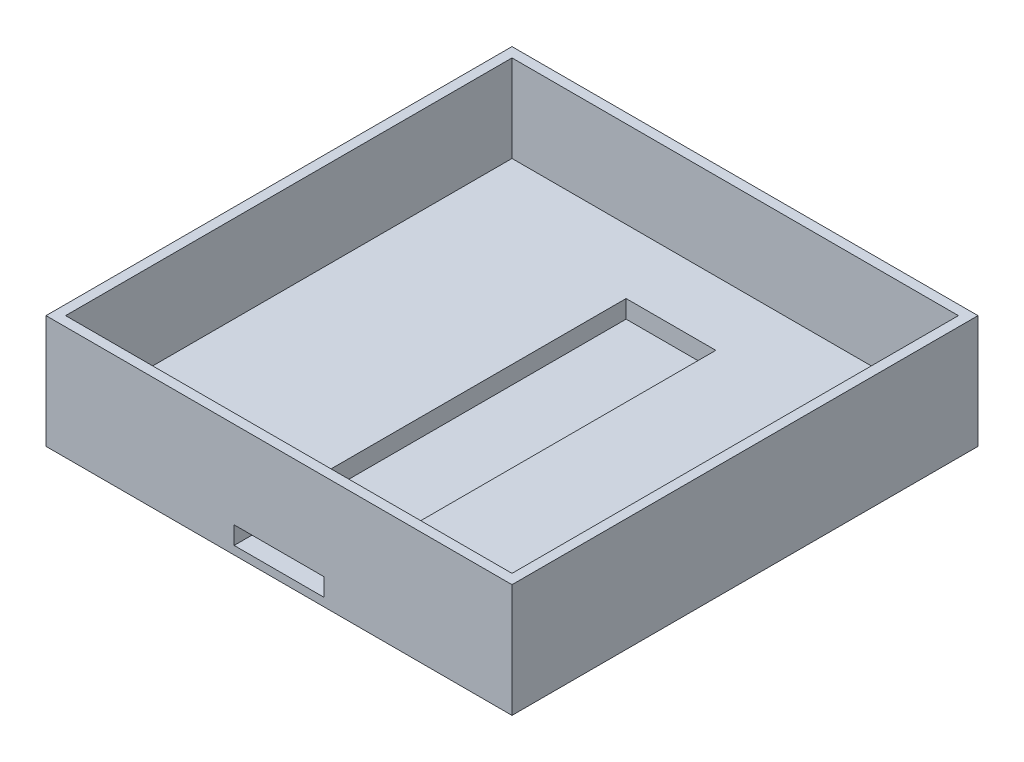
ISO-10303-21;
HEADER;
FILE_DESCRIPTION(('STEP AP214'),'2;1');
FILE_NAME('part.step','',(''),(''),'','','');
FILE_SCHEMA(('AUTOMOTIVE_DESIGN { 1 0 10303 214 1 1 1 1 }'));
ENDSEC;
DATA;
#1=APPLICATION_CONTEXT('core data for automotive mechanical design processes');
#2=APPLICATION_PROTOCOL_DEFINITION('international standard','automotive_design',2000,#1);
#3=PRODUCT_CONTEXT('',#1,'mechanical');
#4=PRODUCT('Part','Part','',(#3));
#5=PRODUCT_RELATED_PRODUCT_CATEGORY('part','',(#4));
#6=PRODUCT_DEFINITION_FORMATION('','',#4);
#7=PRODUCT_DEFINITION_CONTEXT('part definition',#1,'design');
#8=PRODUCT_DEFINITION('design','',#6,#7);
#9=PRODUCT_DEFINITION_SHAPE('','',#8);
#10=(LENGTH_UNIT() NAMED_UNIT(*) SI_UNIT(.MILLI.,.METRE.));
#11=(NAMED_UNIT(*) PLANE_ANGLE_UNIT() SI_UNIT($,.RADIAN.));
#12=(NAMED_UNIT(*) SI_UNIT($,.STERADIAN.) SOLID_ANGLE_UNIT());
#13=UNCERTAINTY_MEASURE_WITH_UNIT(LENGTH_MEASURE(1.E-05),#10,'distance_accuracy_value','');
#14=(GEOMETRIC_REPRESENTATION_CONTEXT(3) GLOBAL_UNCERTAINTY_ASSIGNED_CONTEXT((#13)) GLOBAL_UNIT_ASSIGNED_CONTEXT((#10,
#11,#12)) REPRESENTATION_CONTEXT('',''));
#15=CARTESIAN_POINT('',(0.,0.,0.));
#16=DIRECTION('',(0.,0.,1.));
#17=DIRECTION('',(1.,0.,0.));
#18=AXIS2_PLACEMENT_3D('',#15,#16,#17);
#19=CARTESIAN_POINT('',(-53.5,8.,-53.5));
#20=DIRECTION('',(0.,0.,-1.));
#21=DIRECTION('',(-1.,0.,0.));
#22=AXIS2_PLACEMENT_3D('',#19,#20,#21);
#23=PLANE('',#22);
#24=DIRECTION('',(1.,0.,0.));
#25=VECTOR('',#24,1.);
#26=CARTESIAN_POINT('',(-53.5,0.,-53.5));
#27=LINE('',#26,#25);
#28=CARTESIAN_POINT('',(-53.5,0.,-53.5));
#29=VERTEX_POINT('',#28);
#30=CARTESIAN_POINT('',(53.5,0.,-53.5));
#31=VERTEX_POINT('',#30);
#32=EDGE_CURVE('E221',#29,#31,#27,.T.);
#33=ORIENTED_EDGE('',*,*,#32,.F.);
#34=DIRECTION('',(0.,-1.,0.));
#35=VECTOR('',#34,1.);
#36=CARTESIAN_POINT('',(-53.5,8.,-53.5));
#37=LINE('',#36,#35);
#38=CARTESIAN_POINT('',(-53.5,26.,-53.5));
#39=VERTEX_POINT('',#38);
#40=EDGE_CURVE('E11',#39,#29,#37,.T.);
#41=ORIENTED_EDGE('',*,*,#40,.F.);
#42=DIRECTION('',(-1.,0.,0.));
#43=VECTOR('',#42,1.);
#44=CARTESIAN_POINT('',(-53.5,26.,-53.5));
#45=LINE('',#44,#43);
#46=CARTESIAN_POINT('',(53.5,26.,-53.5));
#47=VERTEX_POINT('',#46);
#48=EDGE_CURVE('E212',#47,#39,#45,.T.);
#49=ORIENTED_EDGE('',*,*,#48,.F.);
#50=DIRECTION('',(0.,-1.,0.));
#51=VECTOR('',#50,1.);
#52=CARTESIAN_POINT('',(53.5,8.,-53.5));
#53=LINE('',#52,#51);
#54=EDGE_CURVE('E42',#47,#31,#53,.T.);
#55=ORIENTED_EDGE('',*,*,#54,.T.);
#56=EDGE_LOOP('',(#33,#41,#49,#55));
#57=FACE_BOUND('',#56,.T.);
#58=ADVANCED_FACE('F39',(#57),#23,.T.);
#59=CARTESIAN_POINT('',(-53.5,8.,53.5));
#60=DIRECTION('',(-1.,0.,0.));
#61=DIRECTION('',(0.,0.,1.));
#62=AXIS2_PLACEMENT_3D('',#59,#60,#61);
#63=PLANE('',#62);
#64=DIRECTION('',(0.,0.,-1.));
#65=VECTOR('',#64,1.);
#66=CARTESIAN_POINT('',(-53.5,0.,53.5));
#67=LINE('',#66,#65);
#68=CARTESIAN_POINT('',(-53.5,0.,53.5));
#69=VERTEX_POINT('',#68);
#70=EDGE_CURVE('E229',#69,#29,#67,.T.);
#71=ORIENTED_EDGE('',*,*,#70,.F.);
#72=DIRECTION('',(0.,-1.,0.));
#73=VECTOR('',#72,1.);
#74=CARTESIAN_POINT('',(-53.5,8.,53.5));
#75=LINE('',#74,#73);
#76=CARTESIAN_POINT('',(-53.5,26.,53.5));
#77=VERTEX_POINT('',#76);
#78=EDGE_CURVE('E47',#77,#69,#75,.T.);
#79=ORIENTED_EDGE('',*,*,#78,.F.);
#80=DIRECTION('',(0.,0.,1.));
#81=VECTOR('',#80,1.);
#82=CARTESIAN_POINT('',(-53.5,26.,53.5));
#83=LINE('',#82,#81);
#84=EDGE_CURVE('E215',#39,#77,#83,.T.);
#85=ORIENTED_EDGE('',*,*,#84,.F.);
#86=ORIENTED_EDGE('',*,*,#40,.T.);
#87=EDGE_LOOP('',(#71,#79,#85,#86));
#88=FACE_BOUND('',#87,.T.);
#89=ADVANCED_FACE('F246',(#88),#63,.T.);
#90=CARTESIAN_POINT('',(-53.5,8.,53.5));
#91=DIRECTION('',(0.,0.,-1.));
#92=DIRECTION('',(-1.,0.,0.));
#93=AXIS2_PLACEMENT_3D('',#90,#91,#92);
#94=PLANE('',#93);
#95=DIRECTION('',(0.,1.,0.));
#96=VECTOR('',#95,1.);
#97=CARTESIAN_POINT('',(10.3,1.9,53.5));
#98=LINE('',#97,#96);
#99=CARTESIAN_POINT('',(10.3,1.9,53.5));
#100=VERTEX_POINT('',#99);
#101=CARTESIAN_POINT('',(10.3,6.,53.5));
#102=VERTEX_POINT('',#101);
#103=EDGE_CURVE('E146',#100,#102,#98,.T.);
#104=ORIENTED_EDGE('',*,*,#103,.F.);
#105=DIRECTION('',(1.,0.,0.));
#106=VECTOR('',#105,1.);
#107=CARTESIAN_POINT('',(-10.3,1.9,53.5));
#108=LINE('',#107,#106);
#109=CARTESIAN_POINT('',(-10.3,1.9,53.5));
#110=VERTEX_POINT('',#109);
#111=EDGE_CURVE('E153',#110,#100,#108,.T.);
#112=ORIENTED_EDGE('',*,*,#111,.F.);
#113=DIRECTION('',(0.,1.,0.));
#114=VECTOR('',#113,1.);
#115=CARTESIAN_POINT('',(-10.3,1.9,53.5));
#116=LINE('',#115,#114);
#117=CARTESIAN_POINT('',(-10.3,6.,53.5));
#118=VERTEX_POINT('',#117);
#119=EDGE_CURVE('E136',#110,#118,#116,.T.);
#120=ORIENTED_EDGE('',*,*,#119,.T.);
#121=DIRECTION('',(1.,0.,0.));
#122=VECTOR('',#121,1.);
#123=CARTESIAN_POINT('',(-10.3,6.,53.5));
#124=LINE('',#123,#122);
#125=EDGE_CURVE('E166',#118,#102,#124,.T.);
#126=ORIENTED_EDGE('',*,*,#125,.T.);
#127=EDGE_LOOP('',(#104,#112,#120,#126));
#128=FACE_BOUND('',#127,.T.);
#129=DIRECTION('',(1.,0.,0.));
#130=VECTOR('',#129,1.);
#131=CARTESIAN_POINT('',(-53.5,0.,53.5));
#132=LINE('',#131,#130);
#133=CARTESIAN_POINT('',(53.5,0.,53.5));
#134=VERTEX_POINT('',#133);
#135=EDGE_CURVE('E227',#69,#134,#132,.T.);
#136=ORIENTED_EDGE('',*,*,#135,.T.);
#137=DIRECTION('',(0.,-1.,0.));
#138=VECTOR('',#137,1.);
#139=CARTESIAN_POINT('',(53.5,8.,53.5));
#140=LINE('',#139,#138);
#141=CARTESIAN_POINT('',(53.5,26.,53.5));
#142=VERTEX_POINT('',#141);
#143=EDGE_CURVE('E232',#142,#134,#140,.T.);
#144=ORIENTED_EDGE('',*,*,#143,.F.);
#145=DIRECTION('',(1.,0.,0.));
#146=VECTOR('',#145,1.);
#147=CARTESIAN_POINT('',(-53.5,26.,53.5));
#148=LINE('',#147,#146);
#149=EDGE_CURVE('E218',#77,#142,#148,.T.);
#150=ORIENTED_EDGE('',*,*,#149,.F.);
#151=ORIENTED_EDGE('',*,*,#78,.T.);
#152=EDGE_LOOP('',(#136,#144,#150,#151));
#153=FACE_BOUND('',#152,.T.);
#154=ADVANCED_FACE('F157',(#128,#153),#94,.F.);
#155=CARTESIAN_POINT('',(53.5,8.,53.5));
#156=DIRECTION('',(-1.,0.,0.));
#157=DIRECTION('',(0.,0.,1.));
#158=AXIS2_PLACEMENT_3D('',#155,#156,#157);
#159=PLANE('',#158);
#160=DIRECTION('',(0.,0.,-1.));
#161=VECTOR('',#160,1.);
#162=CARTESIAN_POINT('',(53.5,0.,53.5));
#163=LINE('',#162,#161);
#164=EDGE_CURVE('E224',#134,#31,#163,.T.);
#165=ORIENTED_EDGE('',*,*,#164,.T.);
#166=ORIENTED_EDGE('',*,*,#54,.F.);
#167=DIRECTION('',(0.,0.,-1.));
#168=VECTOR('',#167,1.);
#169=CARTESIAN_POINT('',(53.5,26.,53.5));
#170=LINE('',#169,#168);
#171=EDGE_CURVE('E203',#142,#47,#170,.T.);
#172=ORIENTED_EDGE('',*,*,#171,.F.);
#173=ORIENTED_EDGE('',*,*,#143,.T.);
#174=EDGE_LOOP('',(#165,#166,#172,#173));
#175=FACE_BOUND('',#174,.T.);
#176=ADVANCED_FACE('F240',(#175),#159,.F.);
#177=CARTESIAN_POINT('',(0.,0.,0.));
#178=DIRECTION('',(0.,1.,0.));
#179=DIRECTION('',(0.,0.,1.));
#180=AXIS2_PLACEMENT_3D('',#177,#178,#179);
#181=PLANE('',#180);
#182=ORIENTED_EDGE('',*,*,#32,.T.);
#183=ORIENTED_EDGE('',*,*,#164,.F.);
#184=ORIENTED_EDGE('',*,*,#135,.F.);
#185=ORIENTED_EDGE('',*,*,#70,.T.);
#186=EDGE_LOOP('',(#182,#183,#184,#185));
#187=FACE_BOUND('',#186,.T.);
#188=ADVANCED_FACE('F243',(#187),#181,.F.);
#189=CARTESIAN_POINT('',(0.,26.,0.));
#190=DIRECTION('',(0.,-1.,0.));
#191=DIRECTION('',(0.,0.,-1.));
#192=AXIS2_PLACEMENT_3D('',#189,#190,#191);
#193=PLANE('',#192);
#194=DIRECTION('',(-1.,0.,0.));
#195=VECTOR('',#194,1.);
#196=CARTESIAN_POINT('',(-51.25,26.,-51.25));
#197=LINE('',#196,#195);
#198=CARTESIAN_POINT('',(51.25,26.,-51.25));
#199=VERTEX_POINT('',#198);
#200=CARTESIAN_POINT('',(-51.25,26.,-51.25));
#201=VERTEX_POINT('',#200);
#202=EDGE_CURVE('E193',#199,#201,#197,.T.);
#203=ORIENTED_EDGE('',*,*,#202,.F.);
#204=DIRECTION('',(0.,0.,-1.));
#205=VECTOR('',#204,1.);
#206=CARTESIAN_POINT('',(51.25,26.,-51.25));
#207=LINE('',#206,#205);
#208=CARTESIAN_POINT('',(51.25,26.,51.25));
#209=VERTEX_POINT('',#208);
#210=EDGE_CURVE('E191',#209,#199,#207,.T.);
#211=ORIENTED_EDGE('',*,*,#210,.F.);
#212=DIRECTION('',(1.,0.,0.));
#213=VECTOR('',#212,1.);
#214=CARTESIAN_POINT('',(-51.25,26.,51.25));
#215=LINE('',#214,#213);
#216=CARTESIAN_POINT('',(-51.25,26.,51.25));
#217=VERTEX_POINT('',#216);
#218=EDGE_CURVE('E180',#217,#209,#215,.T.);
#219=ORIENTED_EDGE('',*,*,#218,.F.);
#220=DIRECTION('',(0.,0.,1.));
#221=VECTOR('',#220,1.);
#222=CARTESIAN_POINT('',(-51.25,26.,-51.25));
#223=LINE('',#222,#221);
#224=EDGE_CURVE('E196',#201,#217,#223,.T.);
#225=ORIENTED_EDGE('',*,*,#224,.F.);
#226=EDGE_LOOP('',(#203,#211,#219,#225));
#227=FACE_BOUND('',#226,.T.);
#228=ORIENTED_EDGE('',*,*,#171,.T.);
#229=ORIENTED_EDGE('',*,*,#48,.T.);
#230=ORIENTED_EDGE('',*,*,#84,.T.);
#231=ORIENTED_EDGE('',*,*,#149,.T.);
#232=EDGE_LOOP('',(#228,#229,#230,#231));
#233=FACE_BOUND('',#232,.T.);
#234=ADVANCED_FACE('F249',(#227,#233),#193,.F.);
#235=CARTESIAN_POINT('',(51.25,6.,-51.25));
#236=DIRECTION('',(1.,0.,0.));
#237=DIRECTION('',(0.,0.,-1.));
#238=AXIS2_PLACEMENT_3D('',#235,#236,#237);
#239=PLANE('',#238);
#240=ORIENTED_EDGE('',*,*,#210,.T.);
#241=DIRECTION('',(0.,1.,0.));
#242=VECTOR('',#241,1.);
#243=CARTESIAN_POINT('',(51.25,6.,-51.25));
#244=LINE('',#243,#242);
#245=CARTESIAN_POINT('',(51.25,6.,-51.25));
#246=VERTEX_POINT('',#245);
#247=EDGE_CURVE('E190',#246,#199,#244,.T.);
#248=ORIENTED_EDGE('',*,*,#247,.F.);
#249=DIRECTION('',(0.,0.,-1.));
#250=VECTOR('',#249,1.);
#251=CARTESIAN_POINT('',(51.25,6.,-51.25));
#252=LINE('',#251,#250);
#253=CARTESIAN_POINT('',(51.25,6.,51.25));
#254=VERTEX_POINT('',#253);
#255=EDGE_CURVE('E176',#254,#246,#252,.T.);
#256=ORIENTED_EDGE('',*,*,#255,.F.);
#257=DIRECTION('',(0.,1.,0.));
#258=VECTOR('',#257,1.);
#259=CARTESIAN_POINT('',(51.25,6.,51.25));
#260=LINE('',#259,#258);
#261=EDGE_CURVE('E201',#254,#209,#260,.T.);
#262=ORIENTED_EDGE('',*,*,#261,.T.);
#263=EDGE_LOOP('',(#240,#248,#256,#262));
#264=FACE_BOUND('',#263,.T.);
#265=ADVANCED_FACE('F285',(#264),#239,.F.);
#266=CARTESIAN_POINT('',(-51.25,6.,51.25));
#267=DIRECTION('',(0.,0.,1.));
#268=DIRECTION('',(1.,0.,0.));
#269=AXIS2_PLACEMENT_3D('',#266,#267,#268);
#270=PLANE('',#269);
#271=ORIENTED_EDGE('',*,*,#218,.T.);
#272=ORIENTED_EDGE('',*,*,#261,.F.);
#273=DIRECTION('',(1.,0.,0.));
#274=VECTOR('',#273,1.);
#275=CARTESIAN_POINT('',(-51.25,6.,51.25));
#276=LINE('',#275,#274);
#277=CARTESIAN_POINT('',(10.3,6.,51.25));
#278=VERTEX_POINT('',#277);
#279=EDGE_CURVE('E186',#278,#254,#276,.T.);
#280=ORIENTED_EDGE('',*,*,#279,.F.);
#281=CARTESIAN_POINT('',(-10.3,6.,51.25));
#282=VERTEX_POINT('',#281);
#283=EDGE_CURVE('E173',#282,#278,#276,.T.);
#284=ORIENTED_EDGE('',*,*,#283,.F.);
#285=CARTESIAN_POINT('',(-51.25,6.,51.25));
#286=VERTEX_POINT('',#285);
#287=EDGE_CURVE('E187',#286,#282,#276,.T.);
#288=ORIENTED_EDGE('',*,*,#287,.F.);
#289=DIRECTION('',(0.,1.,0.));
#290=VECTOR('',#289,1.);
#291=CARTESIAN_POINT('',(-51.25,6.,51.25));
#292=LINE('',#291,#290);
#293=EDGE_CURVE('E204',#286,#217,#292,.T.);
#294=ORIENTED_EDGE('',*,*,#293,.T.);
#295=EDGE_LOOP('',(#271,#272,#280,#284,#288,#294));
#296=FACE_BOUND('',#295,.T.);
#297=ADVANCED_FACE('F296',(#296),#270,.F.);
#298=CARTESIAN_POINT('',(-51.25,6.,-51.25));
#299=DIRECTION('',(-1.,0.,0.));
#300=DIRECTION('',(0.,0.,1.));
#301=AXIS2_PLACEMENT_3D('',#298,#299,#300);
#302=PLANE('',#301);
#303=ORIENTED_EDGE('',*,*,#224,.T.);
#304=ORIENTED_EDGE('',*,*,#293,.F.);
#305=DIRECTION('',(0.,0.,1.));
#306=VECTOR('',#305,1.);
#307=CARTESIAN_POINT('',(-51.25,6.,-51.25));
#308=LINE('',#307,#306);
#309=CARTESIAN_POINT('',(-51.25,6.,-51.25));
#310=VERTEX_POINT('',#309);
#311=EDGE_CURVE('E183',#310,#286,#308,.T.);
#312=ORIENTED_EDGE('',*,*,#311,.F.);
#313=DIRECTION('',(0.,1.,0.));
#314=VECTOR('',#313,1.);
#315=CARTESIAN_POINT('',(-51.25,6.,-51.25));
#316=LINE('',#315,#314);
#317=EDGE_CURVE('E206',#310,#201,#316,.T.);
#318=ORIENTED_EDGE('',*,*,#317,.T.);
#319=EDGE_LOOP('',(#303,#304,#312,#318));
#320=FACE_BOUND('',#319,.T.);
#321=ADVANCED_FACE('F305',(#320),#302,.F.);
#322=CARTESIAN_POINT('',(-51.25,6.,-51.25));
#323=DIRECTION('',(0.,0.,-1.));
#324=DIRECTION('',(-1.,0.,0.));
#325=AXIS2_PLACEMENT_3D('',#322,#323,#324);
#326=PLANE('',#325);
#327=ORIENTED_EDGE('',*,*,#202,.T.);
#328=ORIENTED_EDGE('',*,*,#317,.F.);
#329=DIRECTION('',(-1.,0.,0.));
#330=VECTOR('',#329,1.);
#331=CARTESIAN_POINT('',(-51.25,6.,-51.25));
#332=LINE('',#331,#330);
#333=EDGE_CURVE('E179',#246,#310,#332,.T.);
#334=ORIENTED_EDGE('',*,*,#333,.F.);
#335=ORIENTED_EDGE('',*,*,#247,.T.);
#336=EDGE_LOOP('',(#327,#328,#334,#335));
#337=FACE_BOUND('',#336,.T.);
#338=ADVANCED_FACE('F310',(#337),#326,.F.);
#339=CARTESIAN_POINT('',(0.,6.,0.));
#340=DIRECTION('',(0.,1.,0.));
#341=DIRECTION('',(0.,0.,1.));
#342=AXIS2_PLACEMENT_3D('',#339,#340,#341);
#343=PLANE('',#342);
#344=DIRECTION('',(0.,0.,1.));
#345=VECTOR('',#344,1.);
#346=CARTESIAN_POINT('',(-10.3,6.,53.5));
#347=LINE('',#346,#345);
#348=CARTESIAN_POINT('',(-10.3,6.,-36.5001359753735));
#349=VERTEX_POINT('',#348);
#350=EDGE_CURVE('E164',#349,#282,#347,.T.);
#351=ORIENTED_EDGE('',*,*,#350,.F.);
#352=DIRECTION('',(-1.,0.,0.));
#353=VECTOR('',#352,1.);
#354=CARTESIAN_POINT('',(-10.3,6.,-36.5001359753735));
#355=LINE('',#354,#353);
#356=CARTESIAN_POINT('',(10.3,6.,-36.5001359753735));
#357=VERTEX_POINT('',#356);
#358=EDGE_CURVE('E155',#357,#349,#355,.T.);
#359=ORIENTED_EDGE('',*,*,#358,.F.);
#360=DIRECTION('',(0.,0.,-1.));
#361=VECTOR('',#360,1.);
#362=CARTESIAN_POINT('',(10.3,6.,53.5));
#363=LINE('',#362,#361);
#364=EDGE_CURVE('E168',#278,#357,#363,.T.);
#365=ORIENTED_EDGE('',*,*,#364,.F.);
#366=ORIENTED_EDGE('',*,*,#279,.T.);
#367=ORIENTED_EDGE('',*,*,#255,.T.);
#368=ORIENTED_EDGE('',*,*,#333,.T.);
#369=ORIENTED_EDGE('',*,*,#311,.T.);
#370=ORIENTED_EDGE('',*,*,#287,.T.);
#371=EDGE_LOOP('',(#351,#359,#365,#366,#367,#368,#369,#370));
#372=FACE_BOUND('',#371,.T.);
#373=ADVANCED_FACE('F320',(#372),#343,.T.);
#374=CARTESIAN_POINT('',(0.,6.,0.));
#375=DIRECTION('',(0.,-1.,0.));
#376=DIRECTION('',(0.,0.,-1.));
#377=AXIS2_PLACEMENT_3D('',#374,#375,#376);
#378=PLANE('',#377);
#379=ORIENTED_EDGE('',*,*,#283,.T.);
#380=EDGE_CURVE('E63',#102,#278,#363,.T.);
#381=ORIENTED_EDGE('',*,*,#380,.F.);
#382=ORIENTED_EDGE('',*,*,#125,.F.);
#383=EDGE_CURVE('E142',#282,#118,#347,.T.);
#384=ORIENTED_EDGE('',*,*,#383,.F.);
#385=EDGE_LOOP('',(#379,#381,#382,#384));
#386=FACE_BOUND('',#385,.T.);
#387=ADVANCED_FACE('F344',(#386),#378,.T.);
#388=CARTESIAN_POINT('',(-10.3,1.9,53.5));
#389=DIRECTION('',(-1.,0.,0.));
#390=DIRECTION('',(0.,0.,1.));
#391=AXIS2_PLACEMENT_3D('',#388,#389,#390);
#392=PLANE('',#391);
#393=ORIENTED_EDGE('',*,*,#350,.T.);
#394=ORIENTED_EDGE('',*,*,#383,.T.);
#395=ORIENTED_EDGE('',*,*,#119,.F.);
#396=DIRECTION('',(0.,0.,1.));
#397=VECTOR('',#396,1.);
#398=CARTESIAN_POINT('',(-10.3,1.9,53.5));
#399=LINE('',#398,#397);
#400=CARTESIAN_POINT('',(-10.3,1.9,-36.5001359753735));
#401=VERTEX_POINT('',#400);
#402=EDGE_CURVE('E140',#401,#110,#399,.T.);
#403=ORIENTED_EDGE('',*,*,#402,.F.);
#404=DIRECTION('',(0.,1.,0.));
#405=VECTOR('',#404,1.);
#406=CARTESIAN_POINT('',(-10.3,1.9,-36.5001359753735));
#407=LINE('',#406,#405);
#408=EDGE_CURVE('E171',#401,#349,#407,.T.);
#409=ORIENTED_EDGE('',*,*,#408,.T.);
#410=EDGE_LOOP('',(#393,#394,#395,#403,#409));
#411=FACE_BOUND('',#410,.T.);
#412=ADVANCED_FACE('F139',(#411),#392,.F.);
#413=CARTESIAN_POINT('',(-10.3,1.9,-36.5001359753735));
#414=DIRECTION('',(0.,0.,-1.));
#415=DIRECTION('',(-1.,0.,0.));
#416=AXIS2_PLACEMENT_3D('',#413,#414,#415);
#417=PLANE('',#416);
#418=ORIENTED_EDGE('',*,*,#358,.T.);
#419=ORIENTED_EDGE('',*,*,#408,.F.);
#420=DIRECTION('',(-1.,0.,0.));
#421=VECTOR('',#420,1.);
#422=CARTESIAN_POINT('',(-10.3,1.9,-36.5001359753735));
#423=LINE('',#422,#421);
#424=CARTESIAN_POINT('',(10.3,1.9,-36.5001359753735));
#425=VERTEX_POINT('',#424);
#426=EDGE_CURVE('E147',#425,#401,#423,.T.);
#427=ORIENTED_EDGE('',*,*,#426,.F.);
#428=DIRECTION('',(0.,1.,0.));
#429=VECTOR('',#428,1.);
#430=CARTESIAN_POINT('',(10.3,1.9,-36.5001359753735));
#431=LINE('',#430,#429);
#432=EDGE_CURVE('E55',#425,#357,#431,.T.);
#433=ORIENTED_EDGE('',*,*,#432,.T.);
#434=EDGE_LOOP('',(#418,#419,#427,#433));
#435=FACE_BOUND('',#434,.T.);
#436=ADVANCED_FACE('F364',(#435),#417,.F.);
#437=CARTESIAN_POINT('',(10.3,1.9,53.5));
#438=DIRECTION('',(1.,0.,0.));
#439=DIRECTION('',(0.,0.,-1.));
#440=AXIS2_PLACEMENT_3D('',#437,#438,#439);
#441=PLANE('',#440);
#442=ORIENTED_EDGE('',*,*,#380,.T.);
#443=ORIENTED_EDGE('',*,*,#364,.T.);
#444=ORIENTED_EDGE('',*,*,#432,.F.);
#445=DIRECTION('',(0.,0.,-1.));
#446=VECTOR('',#445,1.);
#447=CARTESIAN_POINT('',(10.3,1.9,53.5));
#448=LINE('',#447,#446);
#449=EDGE_CURVE('E159',#100,#425,#448,.T.);
#450=ORIENTED_EDGE('',*,*,#449,.F.);
#451=ORIENTED_EDGE('',*,*,#103,.T.);
#452=EDGE_LOOP('',(#442,#443,#444,#450,#451));
#453=FACE_BOUND('',#452,.T.);
#454=ADVANCED_FACE('F374',(#453),#441,.F.);
#455=CARTESIAN_POINT('',(0.,1.9,0.));
#456=DIRECTION('',(0.,-1.,0.));
#457=DIRECTION('',(0.,0.,-1.));
#458=AXIS2_PLACEMENT_3D('',#455,#456,#457);
#459=PLANE('',#458);
#460=ORIENTED_EDGE('',*,*,#402,.T.);
#461=ORIENTED_EDGE('',*,*,#111,.T.);
#462=ORIENTED_EDGE('',*,*,#449,.T.);
#463=ORIENTED_EDGE('',*,*,#426,.T.);
#464=EDGE_LOOP('',(#460,#461,#462,#463));
#465=FACE_BOUND('',#464,.T.);
#466=ADVANCED_FACE('F151',(#465),#459,.F.);
#467=CLOSED_SHELL('',(#58,#89,#154,#176,#188,#234,#265,#297,#321,#338,#373,#387,#412,#436,#454,#466));
#468=MANIFOLD_SOLID_BREP('B2',#467);
#469=ADVANCED_BREP_SHAPE_REPRESENTATION('',(#18,#468),#14);
#470=SHAPE_DEFINITION_REPRESENTATION(#9,#469);
ENDSEC;
END-ISO-10303-21;
